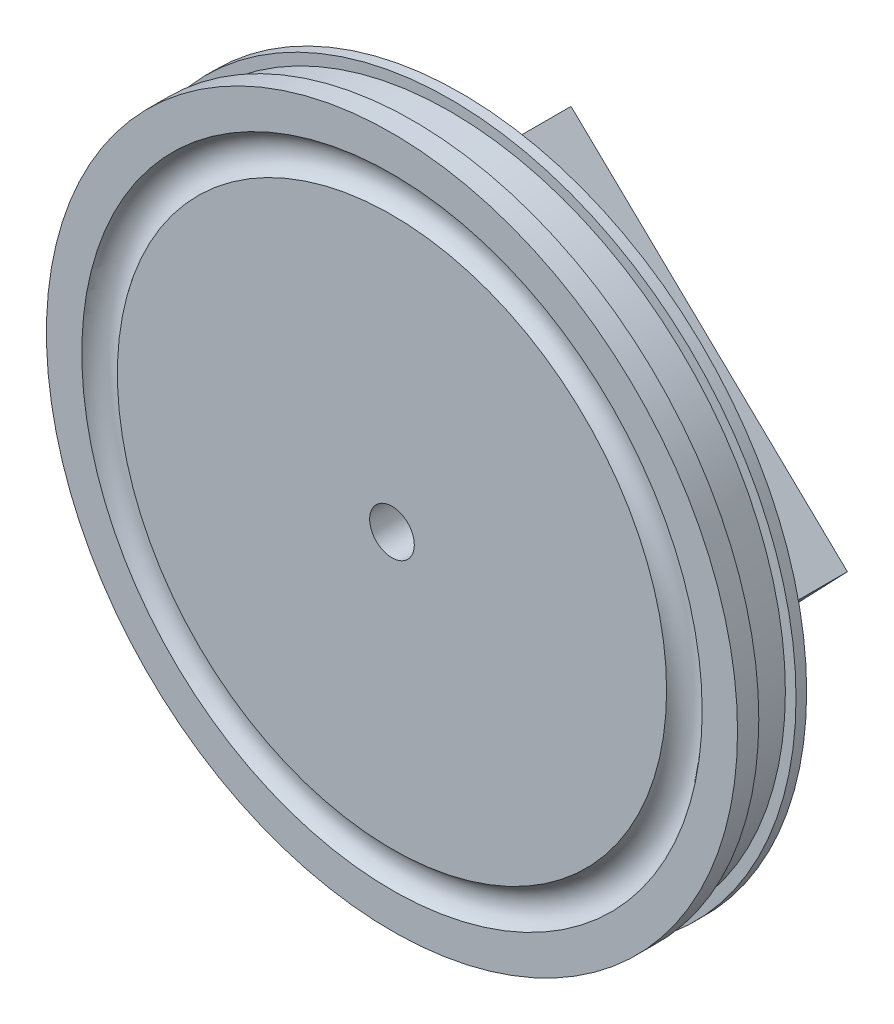
ISO-10303-21;
HEADER;
FILE_DESCRIPTION(('STEP AP214'),'2;1');
FILE_NAME('part.step','',(''),(''),'','','');
FILE_SCHEMA(('AUTOMOTIVE_DESIGN { 1 0 10303 214 1 1 1 1 }'));
ENDSEC;
DATA;
#1=APPLICATION_CONTEXT('core data for automotive mechanical design processes');
#2=APPLICATION_PROTOCOL_DEFINITION('international standard','automotive_design',2000,#1);
#3=PRODUCT_CONTEXT('',#1,'mechanical');
#4=PRODUCT('Part','Part','',(#3));
#5=PRODUCT_RELATED_PRODUCT_CATEGORY('part','',(#4));
#6=PRODUCT_DEFINITION_FORMATION('','',#4);
#7=PRODUCT_DEFINITION_CONTEXT('part definition',#1,'design');
#8=PRODUCT_DEFINITION('design','',#6,#7);
#9=PRODUCT_DEFINITION_SHAPE('','',#8);
#10=(LENGTH_UNIT() NAMED_UNIT(*) SI_UNIT(.MILLI.,.METRE.));
#11=(NAMED_UNIT(*) PLANE_ANGLE_UNIT() SI_UNIT($,.RADIAN.));
#12=(NAMED_UNIT(*) SI_UNIT($,.STERADIAN.) SOLID_ANGLE_UNIT());
#13=UNCERTAINTY_MEASURE_WITH_UNIT(LENGTH_MEASURE(1.E-05),#10,'distance_accuracy_value','');
#14=(GEOMETRIC_REPRESENTATION_CONTEXT(3) GLOBAL_UNCERTAINTY_ASSIGNED_CONTEXT((#13)) GLOBAL_UNIT_ASSIGNED_CONTEXT((#10,
#11,#12)) REPRESENTATION_CONTEXT('',''));
#15=CARTESIAN_POINT('',(0.,0.,0.));
#16=DIRECTION('',(0.,0.,1.));
#17=DIRECTION('',(1.,0.,0.));
#18=AXIS2_PLACEMENT_3D('',#15,#16,#17);
#19=CARTESIAN_POINT('',(22.5865973500949,41.8651611074524,139.421413437516));
#20=DIRECTION('',(0.,0.,1.));
#21=DIRECTION('',(1.,0.,0.));
#22=AXIS2_PLACEMENT_3D('',#19,#20,#21);
#23=TOROIDAL_SURFACE('',#22,55.,3.8);
#24=CARTESIAN_POINT('',(22.5865973500949,41.8651611074524,137.621413437516));
#25=DIRECTION('',(0.,0.,1.));
#26=DIRECTION('',(1.,0.,0.));
#27=AXIS2_PLACEMENT_3D('',#24,#25,#26);
#28=CIRCLE('',#27,51.6533598938637);
#29=CARTESIAN_POINT('',(74.2399572439586,41.8651611074524,137.621413437516));
#30=VERTEX_POINT('',#29);
#31=EDGE_CURVE('E139',#30,#30,#28,.T.);
#32=ORIENTED_EDGE('',*,*,#31,.F.);
#33=EDGE_LOOP('',(#32));
#34=FACE_BOUND('',#33,.T.);
#35=CARTESIAN_POINT('',(22.5865973500949,41.8651611074524,137.621413437516));
#36=DIRECTION('',(0.,0.,1.));
#37=DIRECTION('',(1.,0.,0.));
#38=AXIS2_PLACEMENT_3D('',#35,#36,#37);
#39=CIRCLE('',#38,58.3466401061363);
#40=CARTESIAN_POINT('',(80.9332374562313,41.8651611074524,137.621413437516));
#41=VERTEX_POINT('',#40);
#42=EDGE_CURVE('E170',#41,#41,#39,.T.);
#43=ORIENTED_EDGE('',*,*,#42,.T.);
#44=EDGE_LOOP('',(#43));
#45=FACE_BOUND('',#44,.T.);
#46=ADVANCED_FACE('F46',(#34,#45),#23,.F.);
#47=CARTESIAN_POINT('',(22.5865973500949,41.8651611074524,137.621413437516));
#48=DIRECTION('',(0.,0.,-1.));
#49=DIRECTION('',(-1.,0.,0.));
#50=AXIS2_PLACEMENT_3D('',#47,#48,#49);
#51=PLANE('',#50);
#52=ORIENTED_EDGE('',*,*,#42,.F.);
#53=EDGE_LOOP('',(#52));
#54=FACE_BOUND('',#53,.T.);
#55=CARTESIAN_POINT('',(22.5865973500949,41.8651611074524,137.621413437516));
#56=DIRECTION('',(0.,0.,1.));
#57=DIRECTION('',(1.,0.,0.));
#58=AXIS2_PLACEMENT_3D('',#55,#56,#57);
#59=CIRCLE('',#58,65.);
#60=CARTESIAN_POINT('',(87.5865973500949,41.8651611074524,137.621413437516));
#61=VERTEX_POINT('',#60);
#62=EDGE_CURVE('E175',#61,#61,#59,.T.);
#63=ORIENTED_EDGE('',*,*,#62,.T.);
#64=EDGE_LOOP('',(#63));
#65=FACE_BOUND('',#64,.T.);
#66=ADVANCED_FACE('F215',(#54,#65),#51,.F.);
#67=CARTESIAN_POINT('',(22.5865973500949,41.8651611074524,137.621413437516));
#68=DIRECTION('',(0.,0.,1.));
#69=DIRECTION('',(1.,0.,0.));
#70=AXIS2_PLACEMENT_3D('',#67,#68,#69);
#71=CYLINDRICAL_SURFACE('',#70,65.);
#72=ORIENTED_EDGE('',*,*,#62,.F.);
#73=EDGE_LOOP('',(#72));
#74=FACE_BOUND('',#73,.T.);
#75=CARTESIAN_POINT('',(22.5865973500949,41.8651611074524,133.621413437516));
#76=DIRECTION('',(0.,0.,1.));
#77=DIRECTION('',(1.,0.,0.));
#78=AXIS2_PLACEMENT_3D('',#75,#76,#77);
#79=CIRCLE('',#78,65.);
#80=CARTESIAN_POINT('',(87.5865973500949,41.8651611074524,133.621413437516));
#81=VERTEX_POINT('',#80);
#82=EDGE_CURVE('E162',#81,#81,#79,.T.);
#83=ORIENTED_EDGE('',*,*,#82,.T.);
#84=EDGE_LOOP('',(#83));
#85=FACE_BOUND('',#84,.T.);
#86=ADVANCED_FACE('F222',(#74,#85),#71,.T.);
#87=CARTESIAN_POINT('',(22.5865973500949,41.8651611074524,133.621413437516));
#88=DIRECTION('',(0.,0.,1.));
#89=DIRECTION('',(1.,0.,0.));
#90=AXIS2_PLACEMENT_3D('',#87,#88,#89);
#91=PLANE('',#90);
#92=ORIENTED_EDGE('',*,*,#82,.F.);
#93=EDGE_LOOP('',(#92));
#94=FACE_BOUND('',#93,.T.);
#95=CARTESIAN_POINT('',(22.5865973500949,41.8651611074524,133.621413437516));
#96=DIRECTION('',(0.,0.,1.));
#97=DIRECTION('',(1.,0.,0.));
#98=AXIS2_PLACEMENT_3D('',#95,#96,#97);
#99=CIRCLE('',#98,63.);
#100=CARTESIAN_POINT('',(85.5865973500949,41.8651611074524,133.621413437516));
#101=VERTEX_POINT('',#100);
#102=EDGE_CURVE('E156',#101,#101,#99,.T.);
#103=ORIENTED_EDGE('',*,*,#102,.T.);
#104=EDGE_LOOP('',(#103));
#105=FACE_BOUND('',#104,.T.);
#106=ADVANCED_FACE('F235',(#94,#105),#91,.F.);
#107=CARTESIAN_POINT('',(22.5865973500949,41.8651611074524,137.621413437516));
#108=DIRECTION('',(0.,0.,1.));
#109=DIRECTION('',(1.,0.,0.));
#110=AXIS2_PLACEMENT_3D('',#107,#108,#109);
#111=CYLINDRICAL_SURFACE('',#110,63.);
#112=ORIENTED_EDGE('',*,*,#102,.F.);
#113=EDGE_LOOP('',(#112));
#114=FACE_BOUND('',#113,.T.);
#115=CARTESIAN_POINT('',(22.5865973500949,41.8651611074524,126.621413437516));
#116=DIRECTION('',(0.,0.,1.));
#117=DIRECTION('',(1.,0.,0.));
#118=AXIS2_PLACEMENT_3D('',#115,#116,#117);
#119=CIRCLE('',#118,63.);
#120=CARTESIAN_POINT('',(85.5865973500949,41.8651611074524,126.621413437516));
#121=VERTEX_POINT('',#120);
#122=EDGE_CURVE('E152',#121,#121,#119,.T.);
#123=ORIENTED_EDGE('',*,*,#122,.T.);
#124=EDGE_LOOP('',(#123));
#125=FACE_BOUND('',#124,.T.);
#126=ADVANCED_FACE('F238',(#114,#125),#111,.T.);
#127=CARTESIAN_POINT('',(22.5865973500949,41.8651611074524,126.621413437516));
#128=DIRECTION('',(0.,0.,-1.));
#129=DIRECTION('',(-1.,0.,0.));
#130=AXIS2_PLACEMENT_3D('',#127,#128,#129);
#131=PLANE('',#130);
#132=ORIENTED_EDGE('',*,*,#122,.F.);
#133=EDGE_LOOP('',(#132));
#134=FACE_BOUND('',#133,.T.);
#135=CARTESIAN_POINT('',(22.5865973500949,41.8651611074524,126.621413437516));
#136=DIRECTION('',(0.,0.,1.));
#137=DIRECTION('',(1.,0.,0.));
#138=AXIS2_PLACEMENT_3D('',#135,#136,#137);
#139=CIRCLE('',#138,65.);
#140=CARTESIAN_POINT('',(87.5865973500949,41.8651611074524,126.621413437516));
#141=VERTEX_POINT('',#140);
#142=EDGE_CURVE('E157',#141,#141,#139,.T.);
#143=ORIENTED_EDGE('',*,*,#142,.T.);
#144=EDGE_LOOP('',(#143));
#145=FACE_BOUND('',#144,.T.);
#146=ADVANCED_FACE('F244',(#134,#145),#131,.F.);
#147=CARTESIAN_POINT('',(22.5865973500949,41.8651611074524,137.621413437516));
#148=DIRECTION('',(0.,0.,1.));
#149=DIRECTION('',(1.,0.,0.));
#150=AXIS2_PLACEMENT_3D('',#147,#148,#149);
#151=CYLINDRICAL_SURFACE('',#150,65.);
#152=ORIENTED_EDGE('',*,*,#142,.F.);
#153=EDGE_LOOP('',(#152));
#154=FACE_BOUND('',#153,.T.);
#155=CARTESIAN_POINT('',(22.5865973500949,41.8651611074524,124.621413437516));
#156=DIRECTION('',(0.,0.,1.));
#157=DIRECTION('',(1.,0.,0.));
#158=AXIS2_PLACEMENT_3D('',#155,#156,#157);
#159=CIRCLE('',#158,65.);
#160=CARTESIAN_POINT('',(87.5865973500949,41.8651611074524,124.621413437516));
#161=VERTEX_POINT('',#160);
#162=EDGE_CURVE('E143',#161,#161,#159,.T.);
#163=ORIENTED_EDGE('',*,*,#162,.T.);
#164=EDGE_LOOP('',(#163));
#165=FACE_BOUND('',#164,.T.);
#166=ADVANCED_FACE('F250',(#154,#165),#151,.T.);
#167=CARTESIAN_POINT('',(22.5865973500949,41.8651611074524,124.621413437516));
#168=DIRECTION('',(0.,0.,1.));
#169=DIRECTION('',(1.,0.,0.));
#170=AXIS2_PLACEMENT_3D('',#167,#168,#169);
#171=PLANE('',#170);
#172=DIRECTION('',(0.971238037767916,-0.238110633934583,0.));
#173=VECTOR('',#172,1.);
#174=CARTESIAN_POINT('',(20.8722007857659,34.8722472355232,124.621413437516));
#175=LINE('',#174,#173);
#176=CARTESIAN_POINT('',(16.8348400793879,35.8620545534363,124.621413437516));
#177=VERTEX_POINT('',#176);
#178=CARTESIAN_POINT('',(24.9095614921444,33.88243991761,124.621413437516));
#179=VERTEX_POINT('',#178);
#180=EDGE_CURVE('E174',#177,#179,#175,.T.);
#181=ORIENTED_EDGE('',*,*,#180,.T.);
#182=DIRECTION('',(0.691828876782493,0.722061496861503,0.));
#183=VECTOR('',#182,1.);
#184=CARTESIAN_POINT('',(27.785440127498,36.8839931946182,124.621413437516));
#185=LINE('',#184,#183);
#186=CARTESIAN_POINT('',(30.6613187628514,39.8855464716263,124.621413437516));
#187=VERTEX_POINT('',#186);
#188=EDGE_CURVE('E13',#179,#187,#185,.T.);
#189=ORIENTED_EDGE('',*,*,#188,.T.);
#190=DIRECTION('',(-0.279409160985423,0.960172130796047,0.));
#191=VECTOR('',#190,1.);
#192=CARTESIAN_POINT('',(29.4998366918267,43.8769070665475,124.621413437516));
#193=LINE('',#192,#191);
#194=CARTESIAN_POINT('',(28.3383546208021,47.8682676614685,124.621413437516));
#195=VERTEX_POINT('',#194);
#196=EDGE_CURVE('E53',#187,#195,#193,.T.);
#197=ORIENTED_EDGE('',*,*,#196,.T.);
#198=DIRECTION('',(-0.971238037767922,0.238110633934557,0.));
#199=VECTOR('',#198,1.);
#200=CARTESIAN_POINT('',(24.3009939144238,48.8580749793815,124.621413437516));
#201=LINE('',#200,#199);
#202=CARTESIAN_POINT('',(20.2636332080457,49.8478822972945,124.621413437516));
#203=VERTEX_POINT('',#202);
#204=EDGE_CURVE('E190',#195,#203,#201,.T.);
#205=ORIENTED_EDGE('',*,*,#204,.T.);
#206=DIRECTION('',(-0.691828876782508,-0.722061496861489,0.));
#207=VECTOR('',#206,1.);
#208=CARTESIAN_POINT('',(17.3877545726922,46.8463290202865,124.621413437516));
#209=LINE('',#208,#207);
#210=CARTESIAN_POINT('',(14.5118759373386,43.8447757432784,124.621413437516));
#211=VERTEX_POINT('',#210);
#212=EDGE_CURVE('E187',#203,#211,#209,.T.);
#213=ORIENTED_EDGE('',*,*,#212,.T.);
#214=DIRECTION('',(0.279409160985413,-0.96017213079605,0.));
#215=VECTOR('',#214,1.);
#216=CARTESIAN_POINT('',(15.6733580083633,39.8534151483574,124.621413437516));
#217=LINE('',#216,#215);
#218=EDGE_CURVE('E184',#211,#177,#217,.T.);
#219=ORIENTED_EDGE('',*,*,#218,.T.);
#220=EDGE_LOOP('',(#181,#189,#197,#205,#213,#219));
#221=FACE_BOUND('',#220,.T.);
#222=ORIENTED_EDGE('',*,*,#162,.F.);
#223=EDGE_LOOP('',(#222));
#224=FACE_BOUND('',#223,.T.);
#225=ADVANCED_FACE('F193',(#221,#224),#171,.F.);
#226=CARTESIAN_POINT('',(22.5865973500949,41.8651611074524,137.621413437516));
#227=DIRECTION('',(0.,0.,1.));
#228=DIRECTION('',(1.,0.,0.));
#229=AXIS2_PLACEMENT_3D('',#226,#227,#228);
#230=PLANE('',#229);
#231=CARTESIAN_POINT('',(22.5865973500949,41.8651611074524,137.621413437516));
#232=DIRECTION('',(0.,0.,1.));
#233=DIRECTION('',(1.,0.,0.));
#234=AXIS2_PLACEMENT_3D('',#231,#232,#233);
#235=CIRCLE('',#234,4.2);
#236=CARTESIAN_POINT('',(26.7865973500949,41.8651611074524,137.621413437516));
#237=VERTEX_POINT('',#236);
#238=EDGE_CURVE('E144',#237,#237,#235,.T.);
#239=ORIENTED_EDGE('',*,*,#238,.F.);
#240=EDGE_LOOP('',(#239));
#241=FACE_BOUND('',#240,.T.);
#242=ORIENTED_EDGE('',*,*,#31,.T.);
#243=EDGE_LOOP('',(#242));
#244=FACE_BOUND('',#243,.T.);
#245=ADVANCED_FACE('F259',(#241,#244),#230,.T.);
#246=CARTESIAN_POINT('',(22.5865973500949,41.8651611074524,162.621413437516));
#247=DIRECTION('',(0.,0.,-1.));
#248=DIRECTION('',(-1.,0.,0.));
#249=AXIS2_PLACEMENT_3D('',#246,#247,#248);
#250=CYLINDRICAL_SURFACE('',#249,4.2);
#251=CARTESIAN_POINT('',(22.5865973500949,41.8651611074524,126.621413437516));
#252=DIRECTION('',(0.,0.,1.));
#253=DIRECTION('',(1.,0.,0.));
#254=AXIS2_PLACEMENT_3D('',#251,#252,#253);
#255=CIRCLE('',#254,4.2);
#256=CARTESIAN_POINT('',(26.7865973500949,41.8651611074524,126.621413437516));
#257=VERTEX_POINT('',#256);
#258=EDGE_CURVE('E129',#257,#257,#255,.F.);
#259=ORIENTED_EDGE('',*,*,#258,.T.);
#260=EDGE_LOOP('',(#259));
#261=FACE_BOUND('',#260,.T.);
#262=ORIENTED_EDGE('',*,*,#238,.T.);
#263=EDGE_LOOP('',(#262));
#264=FACE_BOUND('',#263,.T.);
#265=ADVANCED_FACE('F211',(#261,#264),#250,.F.);
#266=CARTESIAN_POINT('',(24.9095614921444,33.88243991761,126.621413437516));
#267=DIRECTION('',(0.722061496861503,-0.691828876782493,0.));
#268=DIRECTION('',(0.691828876782493,0.722061496861503,0.));
#269=AXIS2_PLACEMENT_3D('',#266,#267,#268);
#270=PLANE('',#269);
#271=DIRECTION('',(0.,0.,-1.));
#272=VECTOR('',#271,1.);
#273=CARTESIAN_POINT('',(24.9095614921444,33.88243991761,126.621413437516));
#274=LINE('',#273,#272);
#275=CARTESIAN_POINT('',(24.9095614921444,33.88243991761,126.621413437516));
#276=VERTEX_POINT('',#275);
#277=EDGE_CURVE('E60',#276,#179,#274,.T.);
#278=ORIENTED_EDGE('',*,*,#277,.F.);
#279=DIRECTION('',(-0.691828876782493,-0.722061496861503,0.));
#280=VECTOR('',#279,1.);
#281=CARTESIAN_POINT('',(24.9095614921444,33.88243991761,126.621413437516));
#282=LINE('',#281,#280);
#283=CARTESIAN_POINT('',(30.6613187628514,39.8855464716263,126.621413437516));
#284=VERTEX_POINT('',#283);
#285=EDGE_CURVE('E99',#284,#276,#282,.T.);
#286=ORIENTED_EDGE('',*,*,#285,.F.);
#287=DIRECTION('',(0.,0.,-1.));
#288=VECTOR('',#287,1.);
#289=CARTESIAN_POINT('',(30.6613187628514,39.8855464716263,126.621413437516));
#290=LINE('',#289,#288);
#291=EDGE_CURVE('E127',#284,#187,#290,.T.);
#292=ORIENTED_EDGE('',*,*,#291,.T.);
#293=ORIENTED_EDGE('',*,*,#188,.F.);
#294=EDGE_LOOP('',(#278,#286,#292,#293));
#295=FACE_BOUND('',#294,.T.);
#296=ADVANCED_FACE('F97',(#295),#270,.F.);
#297=CARTESIAN_POINT('',(30.6613187628514,39.8855464716263,126.621413437516));
#298=DIRECTION('',(0.960172130796047,0.279409160985423,0.));
#299=DIRECTION('',(-0.279409160985423,0.960172130796047,0.));
#300=AXIS2_PLACEMENT_3D('',#297,#298,#299);
#301=PLANE('',#300);
#302=ORIENTED_EDGE('',*,*,#291,.F.);
#303=DIRECTION('',(0.279409160985423,-0.960172130796047,0.));
#304=VECTOR('',#303,1.);
#305=CARTESIAN_POINT('',(30.6613187628514,39.8855464716263,126.621413437516));
#306=LINE('',#305,#304);
#307=CARTESIAN_POINT('',(28.3383546208021,47.8682676614685,126.621413437516));
#308=VERTEX_POINT('',#307);
#309=EDGE_CURVE('E103',#308,#284,#306,.T.);
#310=ORIENTED_EDGE('',*,*,#309,.F.);
#311=DIRECTION('',(0.,0.,-1.));
#312=VECTOR('',#311,1.);
#313=CARTESIAN_POINT('',(28.3383546208021,47.8682676614685,126.621413437516));
#314=LINE('',#313,#312);
#315=EDGE_CURVE('E130',#308,#195,#314,.T.);
#316=ORIENTED_EDGE('',*,*,#315,.T.);
#317=ORIENTED_EDGE('',*,*,#196,.F.);
#318=EDGE_LOOP('',(#302,#310,#316,#317));
#319=FACE_BOUND('',#318,.T.);
#320=ADVANCED_FACE('F203',(#319),#301,.F.);
#321=CARTESIAN_POINT('',(28.3383546208021,47.8682676614685,126.621413437516));
#322=DIRECTION('',(0.238110633934557,0.971238037767922,0.));
#323=DIRECTION('',(-0.971238037767922,0.238110633934557,0.));
#324=AXIS2_PLACEMENT_3D('',#321,#322,#323);
#325=PLANE('',#324);
#326=ORIENTED_EDGE('',*,*,#315,.F.);
#327=DIRECTION('',(0.971238037767922,-0.238110633934557,0.));
#328=VECTOR('',#327,1.);
#329=CARTESIAN_POINT('',(28.3383546208021,47.8682676614685,126.621413437516));
#330=LINE('',#329,#328);
#331=CARTESIAN_POINT('',(20.2636332080457,49.8478822972945,126.621413437516));
#332=VERTEX_POINT('',#331);
#333=EDGE_CURVE('E124',#332,#308,#330,.T.);
#334=ORIENTED_EDGE('',*,*,#333,.F.);
#335=DIRECTION('',(0.,0.,-1.));
#336=VECTOR('',#335,1.);
#337=CARTESIAN_POINT('',(20.2636332080457,49.8478822972945,126.621413437516));
#338=LINE('',#337,#336);
#339=EDGE_CURVE('E132',#332,#203,#338,.T.);
#340=ORIENTED_EDGE('',*,*,#339,.T.);
#341=ORIENTED_EDGE('',*,*,#204,.F.);
#342=EDGE_LOOP('',(#326,#334,#340,#341));
#343=FACE_BOUND('',#342,.T.);
#344=ADVANCED_FACE('F202',(#343),#325,.F.);
#345=CARTESIAN_POINT('',(20.2636332080457,49.8478822972945,126.621413437516));
#346=DIRECTION('',(-0.722061496861489,0.691828876782508,0.));
#347=DIRECTION('',(-0.691828876782508,-0.722061496861489,0.));
#348=AXIS2_PLACEMENT_3D('',#345,#346,#347);
#349=PLANE('',#348);
#350=ORIENTED_EDGE('',*,*,#339,.F.);
#351=DIRECTION('',(0.691828876782508,0.722061496861489,0.));
#352=VECTOR('',#351,1.);
#353=CARTESIAN_POINT('',(20.2636332080457,49.8478822972945,126.621413437516));
#354=LINE('',#353,#352);
#355=CARTESIAN_POINT('',(14.5118759373386,43.8447757432784,126.621413437516));
#356=VERTEX_POINT('',#355);
#357=EDGE_CURVE('E121',#356,#332,#354,.T.);
#358=ORIENTED_EDGE('',*,*,#357,.F.);
#359=DIRECTION('',(0.,0.,-1.));
#360=VECTOR('',#359,1.);
#361=CARTESIAN_POINT('',(14.5118759373386,43.8447757432784,126.621413437516));
#362=LINE('',#361,#360);
#363=EDGE_CURVE('E135',#356,#211,#362,.T.);
#364=ORIENTED_EDGE('',*,*,#363,.T.);
#365=ORIENTED_EDGE('',*,*,#212,.F.);
#366=EDGE_LOOP('',(#350,#358,#364,#365));
#367=FACE_BOUND('',#366,.T.);
#368=ADVANCED_FACE('F200',(#367),#349,.F.);
#369=CARTESIAN_POINT('',(14.5118759373386,43.8447757432784,126.621413437516));
#370=DIRECTION('',(-0.96017213079605,-0.279409160985413,0.));
#371=DIRECTION('',(0.279409160985413,-0.96017213079605,0.));
#372=AXIS2_PLACEMENT_3D('',#369,#370,#371);
#373=PLANE('',#372);
#374=ORIENTED_EDGE('',*,*,#363,.F.);
#375=DIRECTION('',(-0.279409160985413,0.96017213079605,0.));
#376=VECTOR('',#375,1.);
#377=CARTESIAN_POINT('',(14.5118759373386,43.8447757432784,126.621413437516));
#378=LINE('',#377,#376);
#379=CARTESIAN_POINT('',(16.8348400793879,35.8620545534363,126.621413437516));
#380=VERTEX_POINT('',#379);
#381=EDGE_CURVE('E112',#380,#356,#378,.T.);
#382=ORIENTED_EDGE('',*,*,#381,.F.);
#383=DIRECTION('',(0.,0.,-1.));
#384=VECTOR('',#383,1.);
#385=CARTESIAN_POINT('',(16.8348400793879,35.8620545534363,126.621413437516));
#386=LINE('',#385,#384);
#387=EDGE_CURVE('E102',#380,#177,#386,.T.);
#388=ORIENTED_EDGE('',*,*,#387,.T.);
#389=ORIENTED_EDGE('',*,*,#218,.F.);
#390=EDGE_LOOP('',(#374,#382,#388,#389));
#391=FACE_BOUND('',#390,.T.);
#392=ADVANCED_FACE('F196',(#391),#373,.F.);
#393=CARTESIAN_POINT('',(16.8348400793879,35.8620545534363,126.621413437516));
#394=DIRECTION('',(-0.238110633934583,-0.971238037767916,0.));
#395=DIRECTION('',(0.971238037767916,-0.238110633934583,0.));
#396=AXIS2_PLACEMENT_3D('',#393,#394,#395);
#397=PLANE('',#396);
#398=ORIENTED_EDGE('',*,*,#387,.F.);
#399=DIRECTION('',(-0.971238037767916,0.238110633934583,0.));
#400=VECTOR('',#399,1.);
#401=CARTESIAN_POINT('',(16.8348400793879,35.8620545534363,126.621413437516));
#402=LINE('',#401,#400);
#403=EDGE_CURVE('E106',#276,#380,#402,.T.);
#404=ORIENTED_EDGE('',*,*,#403,.F.);
#405=ORIENTED_EDGE('',*,*,#277,.T.);
#406=ORIENTED_EDGE('',*,*,#180,.F.);
#407=EDGE_LOOP('',(#398,#404,#405,#406));
#408=FACE_BOUND('',#407,.T.);
#409=ADVANCED_FACE('F107',(#408),#397,.F.);
#410=CARTESIAN_POINT('',(0.,0.,126.621413437516));
#411=DIRECTION('',(0.,0.,1.));
#412=DIRECTION('',(1.,0.,0.));
#413=AXIS2_PLACEMENT_3D('',#410,#411,#412);
#414=PLANE('',#413);
#415=ORIENTED_EDGE('',*,*,#285,.T.);
#416=ORIENTED_EDGE('',*,*,#403,.T.);
#417=ORIENTED_EDGE('',*,*,#381,.T.);
#418=ORIENTED_EDGE('',*,*,#357,.T.);
#419=ORIENTED_EDGE('',*,*,#333,.T.);
#420=ORIENTED_EDGE('',*,*,#309,.T.);
#421=EDGE_LOOP('',(#415,#416,#417,#418,#419,#420));
#422=FACE_BOUND('',#421,.T.);
#423=ORIENTED_EDGE('',*,*,#258,.F.);
#424=EDGE_LOOP('',(#423));
#425=FACE_BOUND('',#424,.T.);
#426=ADVANCED_FACE('F114',(#422,#425),#414,.F.);
#427=CLOSED_SHELL('',(#46,#66,#86,#106,#126,#146,#166,#225,#245,#265,#296,#320,#344,#368,#392,
#409,#426));
#428=MANIFOLD_SOLID_BREP('B2',#427);
#429=CARTESIAN_POINT('',(-44.4883245814592,141.208387733411,124.621413437516));
#430=DIRECTION('',(0.,0.,-1.));
#431=DIRECTION('',(0.691828876782508,0.722061496861488,0.));
#432=AXIS2_PLACEMENT_3D('',#429,#430,#431);
#433=PLANE('',#432);
#434=DIRECTION('',(0.279409160985423,-0.960172130796047,0.));
#435=VECTOR('',#434,1.);
#436=CARTESIAN_POINT('',(-2.38855673537105,153.459379440288,124.621413437516));
#437=LINE('',#436,#435);
#438=CARTESIAN_POINT('',(28.3383546208021,47.8682676614685,124.621413437516));
#439=VERTEX_POINT('',#438);
#440=CARTESIAN_POINT('',(30.6613187628514,39.8855464716263,124.621413437516));
#441=VERTEX_POINT('',#440);
#442=EDGE_CURVE('E529',#439,#441,#437,.T.);
#443=ORIENTED_EDGE('',*,*,#442,.T.);
#444=DIRECTION('',(-0.691828876782493,-0.722061496861503,0.));
#445=VECTOR('',#444,1.);
#446=CARTESIAN_POINT('',(45.3077713016001,55.1720425962521,124.621413437516));
#447=LINE('',#446,#445);
#448=CARTESIAN_POINT('',(24.9095614921444,33.88243991761,124.621413437516));
#449=VERTEX_POINT('',#448);
#450=EDGE_CURVE('E520',#441,#449,#447,.T.);
#451=ORIENTED_EDGE('',*,*,#450,.T.);
#452=DIRECTION('',(-0.971238037767916,0.238110633934583,0.));
#453=VECTOR('',#452,1.);
#454=CARTESIAN_POINT('',(-65.3741198584709,56.0165653990914,124.621413437516));
#455=LINE('',#454,#453);
#456=CARTESIAN_POINT('',(16.8348400793879,35.8620545534363,124.621413437516));
#457=VERTEX_POINT('',#456);
#458=EDGE_CURVE('E526',#449,#457,#455,.T.);
#459=ORIENTED_EDGE('',*,*,#458,.T.);
#460=DIRECTION('',(-0.279409160985413,0.96017213079605,0.));
#461=VECTOR('',#460,1.);
#462=CARTESIAN_POINT('',(-16.2150354188332,149.435887522098,124.621413437516));
#463=LINE('',#462,#461);
#464=CARTESIAN_POINT('',(14.5118759373386,43.8447757432784,124.621413437516));
#465=VERTEX_POINT('',#464);
#466=EDGE_CURVE('E503',#457,#465,#463,.T.);
#467=ORIENTED_EDGE('',*,*,#466,.T.);
#468=DIRECTION('',(0.691828876782508,0.722061496861489,0.));
#469=VECTOR('',#468,1.);
#470=CARTESIAN_POINT('',(34.910085746793,65.1343784219183,124.621413437516));
#471=LINE('',#470,#469);
#472=CARTESIAN_POINT('',(20.2636332080457,49.8478822972945,124.621413437516));
#473=VERTEX_POINT('',#472);
#474=EDGE_CURVE('E514',#465,#473,#471,.T.);
#475=ORIENTED_EDGE('',*,*,#474,.T.);
#476=DIRECTION('',(0.971238037767922,-0.238110633934557,0.));
#477=VECTOR('',#476,1.);
#478=CARTESIAN_POINT('',(-61.9453267298115,70.002393142947,124.621413437516));
#479=LINE('',#478,#477);
#480=EDGE_CURVE('E527',#473,#439,#479,.T.);
#481=ORIENTED_EDGE('',*,*,#480,.T.);
#482=EDGE_LOOP('',(#443,#451,#459,#467,#475,#481));
#483=FACE_BOUND('',#482,.T.);
#484=DIRECTION('',(0.722061496861488,-0.691828876782508,0.));
#485=VECTOR('',#484,1.);
#486=CARTESIAN_POINT('',(19.5239984122433,-13.3672613249003,124.621413437516));
#487=LINE('',#486,#485);
#488=CARTESIAN_POINT('',(-28.8541218774764,32.9852734195278,124.621413437516));
#489=VERTEX_POINT('',#488);
#490=CARTESIAN_POINT('',(15.9136909279358,-9.90811694098775,124.621413437516));
#491=VERTEX_POINT('',#490);
#492=EDGE_CURVE('E634',#489,#491,#487,.T.);
#493=ORIENTED_EDGE('',*,*,#492,.T.);
#494=CARTESIAN_POINT('',(19.3728353118484,-6.2978094566803,124.621413437516));
#495=DIRECTION('',(0.,0.,-1.));
#496=DIRECTION('',(0.,1.,0.));
#497=AXIS2_PLACEMENT_3D('',#494,#495,#496);
#498=CIRCLE('',#497,5.);
#499=CARTESIAN_POINT('',(22.9831427961559,-9.75695384059284,124.621413437516));
#500=VERTEX_POINT('',#499);
#501=EDGE_CURVE('E391',#491,#500,#498,.F.);
#502=ORIENTED_EDGE('',*,*,#501,.T.);
#503=DIRECTION('',(0.691828876782508,0.722061496861488,0.));
#504=VECTOR('',#503,1.);
#505=CARTESIAN_POINT('',(85.2477417065816,55.2285808769411,124.621413437516));
#506=LINE('',#505,#504);
#507=CARTESIAN_POINT('',(85.2477417065816,55.2285808769411,124.621413437516));
#508=VERTEX_POINT('',#507);
#509=EDGE_CURVE('E632',#500,#508,#506,.T.);
#510=ORIENTED_EDGE('',*,*,#509,.T.);
#511=DIRECTION('',(-0.722061496861488,0.691828876782508,0.));
#512=VECTOR('',#511,1.);
#513=CARTESIAN_POINT('',(85.2477417065816,55.2285808769411,124.621413437516));
#514=LINE('',#513,#512);
#515=CARTESIAN_POINT('',(33.2593139325544,105.040260005282,124.621413437516));
#516=VERTEX_POINT('',#515);
#517=EDGE_CURVE('E641',#508,#516,#514,.T.);
#518=ORIENTED_EDGE('',*,*,#517,.T.);
#519=DIRECTION('',(-0.691828876782508,-0.722061496861488,0.));
#520=VECTOR('',#519,1.);
#521=CARTESIAN_POINT('',(33.2593139325544,105.040260005282,124.621413437516));
#522=LINE('',#521,#520);
#523=CARTESIAN_POINT('',(-29.0052849778713,40.0547252877477,124.621413437516));
#524=VERTEX_POINT('',#523);
#525=EDGE_CURVE('E782',#516,#524,#522,.T.);
#526=ORIENTED_EDGE('',*,*,#525,.T.);
#527=CARTESIAN_POINT('',(-25.3949774935639,36.5955809038352,124.621413437516));
#528=DIRECTION('',(0.,0.,-1.));
#529=DIRECTION('',(0.,1.,0.));
#530=AXIS2_PLACEMENT_3D('',#527,#528,#529);
#531=CIRCLE('',#530,5.);
#532=EDGE_CURVE('E628',#524,#489,#531,.F.);
#533=ORIENTED_EDGE('',*,*,#532,.T.);
#534=EDGE_LOOP('',(#493,#502,#510,#518,#526,#533));
#535=FACE_BOUND('',#534,.T.);
#536=CARTESIAN_POINT('',(53.2689288891572,62.324743980206,124.621413437516));
#537=DIRECTION('',(0.,0.,1.));
#538=DIRECTION('',(-0.691828876782508,-0.722061496861488,0.));
#539=AXIS2_PLACEMENT_3D('',#536,#537,#538);
#540=CIRCLE('',#539,2.20000000000001);
#541=CARTESIAN_POINT('',(51.7469053602357,60.7362086871107,124.621413437516));
#542=VERTEX_POINT('',#541);
#543=EDGE_CURVE('E789',#542,#542,#540,.T.);
#544=ORIENTED_EDGE('',*,*,#543,.F.);
#545=EDGE_LOOP('',(#544));
#546=FACE_BOUND('',#545,.T.);
#547=CARTESIAN_POINT('',(41.7159449393734,73.3940060087261,124.621413437516));
#548=DIRECTION('',(0.,0.,1.));
#549=DIRECTION('',(-0.691828876782508,-0.722061496861488,0.));
#550=AXIS2_PLACEMENT_3D('',#547,#548,#549);
#551=CIRCLE('',#550,2.2);
#552=CARTESIAN_POINT('',(40.1939214104519,71.8054707156309,124.621413437516));
#553=VERTEX_POINT('',#552);
#554=EDGE_CURVE('E578',#553,#553,#551,.T.);
#555=ORIENTED_EDGE('',*,*,#554,.F.);
#556=EDGE_LOOP('',(#555));
#557=FACE_BOUND('',#556,.T.);
#558=CARTESIAN_POINT('',(17.9856561732493,25.4996076402701,124.621413437516));
#559=DIRECTION('',(0.,0.,1.));
#560=DIRECTION('',(-0.691828876782508,-0.722061496861488,0.));
#561=AXIS2_PLACEMENT_3D('',#558,#559,#560);
#562=CIRCLE('',#561,2.1942799116235);
#563=CARTESIAN_POINT('',(16.4675899666444,23.9152026027501,124.621413437516));
#564=VERTEX_POINT('',#563);
#565=EDGE_CURVE('E574',#564,#564,#562,.T.);
#566=ORIENTED_EDGE('',*,*,#565,.F.);
#567=EDGE_LOOP('',(#566));
#568=FACE_BOUND('',#567,.T.);
#569=CARTESIAN_POINT('',(6.4326722234655,36.5688696687902,124.621413437516));
#570=DIRECTION('',(0.,0.,1.));
#571=DIRECTION('',(-0.691828876782508,-0.722061496861488,0.));
#572=AXIS2_PLACEMENT_3D('',#569,#570,#571);
#573=CIRCLE('',#572,2.20000000000001);
#574=CARTESIAN_POINT('',(4.91064869454398,34.980334375695,124.621413437516));
#575=VERTEX_POINT('',#574);
#576=EDGE_CURVE('E575',#575,#575,#573,.T.);
#577=ORIENTED_EDGE('',*,*,#576,.F.);
#578=EDGE_LOOP('',(#577));
#579=FACE_BOUND('',#578,.T.);
#580=ADVANCED_FACE('F383',(#483,#535,#546,#557,#568,#579),#433,.F.);
#581=CARTESIAN_POINT('',(-44.4883245814592,141.208387733411,114.621413437516));
#582=DIRECTION('',(0.,0.,-1.));
#583=DIRECTION('',(0.691828876782508,0.722061496861488,0.));
#584=AXIS2_PLACEMENT_3D('',#581,#582,#583);
#585=PLANE('',#584);
#586=CARTESIAN_POINT('',(17.5019342519856,48.1218536185741,114.621413437516));
#587=DIRECTION('',(0.,0.,-1.));
#588=DIRECTION('',(0.,1.,0.));
#589=AXIS2_PLACEMENT_3D('',#586,#587,#588);
#590=CIRCLE('',#589,3.);
#591=CARTESIAN_POINT('',(16.0792526398058,45.4806461238162,114.621413437516));
#592=VERTEX_POINT('',#591);
#593=CARTESIAN_POINT('',(20.0799142591439,49.65613491048,114.621413437516));
#594=VERTEX_POINT('',#593);
#595=EDGE_CURVE('E540',#592,#594,#590,.T.);
#596=ORIENTED_EDGE('',*,*,#595,.F.);
#597=DIRECTION('',(0.691828876782508,0.722061496861488,0.));
#598=VECTOR('',#597,1.);
#599=CARTESIAN_POINT('',(20.2636332080457,49.8478822972945,114.621413437516));
#600=LINE('',#599,#598);
#601=CARTESIAN_POINT('',(14.5118759373386,43.8447757432784,114.621413437516));
#602=VERTEX_POINT('',#601);
#603=EDGE_CURVE('E692',#602,#592,#600,.T.);
#604=ORIENTED_EDGE('',*,*,#603,.F.);
#605=DIRECTION('',(-0.279409160985413,0.96017213079605,0.));
#606=VECTOR('',#605,1.);
#607=CARTESIAN_POINT('',(14.5118759373386,43.8447757432784,114.621413437516));
#608=LINE('',#607,#606);
#609=CARTESIAN_POINT('',(16.8348400793879,35.8620545534363,114.621413437516));
#610=VERTEX_POINT('',#609);
#611=EDGE_CURVE('E506',#610,#602,#608,.T.);
#612=ORIENTED_EDGE('',*,*,#611,.F.);
#613=DIRECTION('',(-0.971238037767915,0.238110633934583,0.));
#614=VECTOR('',#613,1.);
#615=CARTESIAN_POINT('',(16.8348400793879,35.8620545534363,114.621413437516));
#616=LINE('',#615,#614);
#617=CARTESIAN_POINT('',(24.9095614921444,33.8824399176099,114.621413437516));
#618=VERTEX_POINT('',#617);
#619=EDGE_CURVE('E555',#618,#610,#616,.T.);
#620=ORIENTED_EDGE('',*,*,#619,.F.);
#621=DIRECTION('',(-0.691828876782494,-0.722061496861502,0.));
#622=VECTOR('',#621,1.);
#623=CARTESIAN_POINT('',(24.9095614921444,33.8824399176099,114.621413437516));
#624=LINE('',#623,#622);
#625=CARTESIAN_POINT('',(26.4769381946114,35.5183102981476,114.621413437516));
#626=VERTEX_POINT('',#625);
#627=EDGE_CURVE('E671',#626,#618,#624,.T.);
#628=ORIENTED_EDGE('',*,*,#627,.F.);
#629=CARTESIAN_POINT('',(29.0549182017692,37.0525915900542,114.621413437516));
#630=DIRECTION('',(0.,0.,-1.));
#631=DIRECTION('',(0.,1.,0.));
#632=AXIS2_PLACEMENT_3D('',#629,#630,#631);
#633=CIRCLE('',#632,3.);
#634=CARTESIAN_POINT('',(30.4775998139496,39.6937990848118,114.621413437516));
#635=VERTEX_POINT('',#634);
#636=EDGE_CURVE('E535',#635,#626,#633,.T.);
#637=ORIENTED_EDGE('',*,*,#636,.F.);
#638=CARTESIAN_POINT('',(30.6613187628514,39.8855464716263,114.621413437516));
#639=VERTEX_POINT('',#638);
#640=EDGE_CURVE('E667',#639,#635,#624,.T.);
#641=ORIENTED_EDGE('',*,*,#640,.F.);
#642=DIRECTION('',(0.279409160985423,-0.960172130796048,0.));
#643=VECTOR('',#642,1.);
#644=CARTESIAN_POINT('',(30.6613187628514,39.8855464716263,114.621413437516));
#645=LINE('',#644,#643);
#646=CARTESIAN_POINT('',(28.3383546208021,47.8682676614685,114.621413437516));
#647=VERTEX_POINT('',#646);
#648=EDGE_CURVE('E672',#647,#639,#645,.T.);
#649=ORIENTED_EDGE('',*,*,#648,.F.);
#650=DIRECTION('',(0.971238037767922,-0.238110633934557,0.));
#651=VECTOR('',#650,1.);
#652=CARTESIAN_POINT('',(28.3383546208021,47.8682676614685,114.621413437516));
#653=LINE('',#652,#651);
#654=CARTESIAN_POINT('',(20.2636332080457,49.8478822972945,114.621413437516));
#655=VERTEX_POINT('',#654);
#656=EDGE_CURVE('E689',#655,#647,#653,.T.);
#657=ORIENTED_EDGE('',*,*,#656,.F.);
#658=EDGE_CURVE('E694',#594,#655,#600,.T.);
#659=ORIENTED_EDGE('',*,*,#658,.F.);
#660=EDGE_LOOP('',(#596,#604,#612,#620,#628,#637,#641,#649,#657,#659));
#661=FACE_BOUND('',#660,.T.);
#662=CARTESIAN_POINT('',(17.9856561732493,25.4996076402701,114.621413437516));
#663=DIRECTION('',(0.,0.,1.));
#664=DIRECTION('',(-0.691828876782508,-0.722061496861488,0.));
#665=AXIS2_PLACEMENT_3D('',#662,#663,#664);
#666=CIRCLE('',#665,2.1942799116235);
#667=CARTESIAN_POINT('',(16.4675899666444,23.9152026027501,114.621413437516));
#668=VERTEX_POINT('',#667);
#669=EDGE_CURVE('E569',#668,#668,#666,.T.);
#670=ORIENTED_EDGE('',*,*,#669,.T.);
#671=EDGE_LOOP('',(#670));
#672=FACE_BOUND('',#671,.T.);
#673=CARTESIAN_POINT('',(53.2689288891572,62.324743980206,114.621413437516));
#674=DIRECTION('',(0.,0.,1.));
#675=DIRECTION('',(-0.691828876782508,-0.722061496861488,0.));
#676=AXIS2_PLACEMENT_3D('',#673,#674,#675);
#677=CIRCLE('',#676,2.20000000000001);
#678=CARTESIAN_POINT('',(51.7469053602357,60.7362086871107,114.621413437516));
#679=VERTEX_POINT('',#678);
#680=EDGE_CURVE('E582',#679,#679,#677,.T.);
#681=ORIENTED_EDGE('',*,*,#680,.T.);
#682=EDGE_LOOP('',(#681));
#683=FACE_BOUND('',#682,.T.);
#684=DIRECTION('',(0.691828876782508,0.722061496861488,0.));
#685=VECTOR('',#684,1.);
#686=CARTESIAN_POINT('',(85.2477417065816,55.2285808769411,114.621413437516));
#687=LINE('',#686,#685);
#688=CARTESIAN_POINT('',(22.9831427961559,-9.75695384059284,114.621413437516));
#689=VERTEX_POINT('',#688);
#690=CARTESIAN_POINT('',(85.2477417065816,55.2285808769411,114.621413437516));
#691=VERTEX_POINT('',#690);
#692=EDGE_CURVE('E650',#689,#691,#687,.T.);
#693=ORIENTED_EDGE('',*,*,#692,.F.);
#694=CARTESIAN_POINT('',(19.3728353118484,-6.2978094566803,114.621413437516));
#695=DIRECTION('',(0.,0.,-1.));
#696=DIRECTION('',(0.,1.,0.));
#697=AXIS2_PLACEMENT_3D('',#694,#695,#696);
#698=CIRCLE('',#697,5.);
#699=CARTESIAN_POINT('',(15.9136909279358,-9.90811694098775,114.621413437516));
#700=VERTEX_POINT('',#699);
#701=EDGE_CURVE('E622',#689,#700,#698,.T.);
#702=ORIENTED_EDGE('',*,*,#701,.T.);
#703=DIRECTION('',(0.722061496861488,-0.691828876782508,0.));
#704=VECTOR('',#703,1.);
#705=CARTESIAN_POINT('',(19.5239984122433,-13.3672613249003,114.621413437516));
#706=LINE('',#705,#704);
#707=CARTESIAN_POINT('',(-28.8541218774764,32.9852734195278,114.621413437516));
#708=VERTEX_POINT('',#707);
#709=EDGE_CURVE('E642',#708,#700,#706,.T.);
#710=ORIENTED_EDGE('',*,*,#709,.F.);
#711=CARTESIAN_POINT('',(-25.3949774935639,36.5955809038352,114.621413437516));
#712=DIRECTION('',(0.,0.,-1.));
#713=DIRECTION('',(0.,1.,0.));
#714=AXIS2_PLACEMENT_3D('',#711,#712,#713);
#715=CIRCLE('',#714,5.);
#716=CARTESIAN_POINT('',(-29.0052849778713,40.0547252877477,114.621413437516));
#717=VERTEX_POINT('',#716);
#718=EDGE_CURVE('E620',#708,#717,#715,.T.);
#719=ORIENTED_EDGE('',*,*,#718,.T.);
#720=DIRECTION('',(-0.691828876782508,-0.722061496861488,0.));
#721=VECTOR('',#720,1.);
#722=CARTESIAN_POINT('',(33.2593139325544,105.040260005282,114.621413437516));
#723=LINE('',#722,#721);
#724=CARTESIAN_POINT('',(33.2593139325544,105.040260005282,114.621413437516));
#725=VERTEX_POINT('',#724);
#726=EDGE_CURVE('E653',#725,#717,#723,.T.);
#727=ORIENTED_EDGE('',*,*,#726,.F.);
#728=DIRECTION('',(-0.722061496861488,0.691828876782508,0.));
#729=VECTOR('',#728,1.);
#730=CARTESIAN_POINT('',(85.2477417065816,55.2285808769411,114.621413437516));
#731=LINE('',#730,#729);
#732=EDGE_CURVE('E654',#691,#725,#731,.T.);
#733=ORIENTED_EDGE('',*,*,#732,.F.);
#734=EDGE_LOOP('',(#693,#702,#710,#719,#727,#733));
#735=FACE_BOUND('',#734,.T.);
#736=CARTESIAN_POINT('',(41.7159449393734,73.3940060087261,114.621413437516));
#737=DIRECTION('',(0.,0.,1.));
#738=DIRECTION('',(-0.691828876782508,-0.722061496861488,0.));
#739=AXIS2_PLACEMENT_3D('',#736,#737,#738);
#740=CIRCLE('',#739,2.2);
#741=CARTESIAN_POINT('',(40.1939214104519,71.8054707156309,114.621413437516));
#742=VERTEX_POINT('',#741);
#743=EDGE_CURVE('E583',#742,#742,#740,.T.);
#744=ORIENTED_EDGE('',*,*,#743,.T.);
#745=EDGE_LOOP('',(#744));
#746=FACE_BOUND('',#745,.T.);
#747=CARTESIAN_POINT('',(6.4326722234655,36.5688696687902,114.621413437516));
#748=DIRECTION('',(0.,0.,1.));
#749=DIRECTION('',(-0.691828876782508,-0.722061496861488,0.));
#750=AXIS2_PLACEMENT_3D('',#747,#748,#749);
#751=CIRCLE('',#750,2.20000000000001);
#752=CARTESIAN_POINT('',(4.91064869454398,34.980334375695,114.621413437516));
#753=VERTEX_POINT('',#752);
#754=EDGE_CURVE('E594',#753,#753,#751,.T.);
#755=ORIENTED_EDGE('',*,*,#754,.T.);
#756=EDGE_LOOP('',(#755));
#757=FACE_BOUND('',#756,.T.);
#758=ADVANCED_FACE('F647',(#661,#672,#683,#735,#746,#757),#585,.T.);
#759=CARTESIAN_POINT('',(85.2477417065816,55.2285808769411,124.621413437516));
#760=DIRECTION('',(-0.722061496861488,0.691828876782508,0.));
#761=DIRECTION('',(-0.691828876782508,-0.722061496861488,0.));
#762=AXIS2_PLACEMENT_3D('',#759,#760,#761);
#763=PLANE('',#762);
#764=ORIENTED_EDGE('',*,*,#509,.F.);
#765=DIRECTION('',(0.,0.,-1.));
#766=VECTOR('',#765,1.);
#767=CARTESIAN_POINT('',(22.9831427961558,-9.75695384059283,124.621413437516));
#768=LINE('',#767,#766);
#769=EDGE_CURVE('E617',#500,#689,#768,.T.);
#770=ORIENTED_EDGE('',*,*,#769,.T.);
#771=ORIENTED_EDGE('',*,*,#692,.T.);
#772=DIRECTION('',(0.,0.,-1.));
#773=VECTOR('',#772,1.);
#774=CARTESIAN_POINT('',(85.2477417065816,55.2285808769411,124.621413437516));
#775=LINE('',#774,#773);
#776=EDGE_CURVE('E603',#508,#691,#775,.T.);
#777=ORIENTED_EDGE('',*,*,#776,.F.);
#778=EDGE_LOOP('',(#764,#770,#771,#777));
#779=FACE_BOUND('',#778,.T.);
#780=ADVANCED_FACE('F639',(#779),#763,.F.);
#781=CARTESIAN_POINT('',(85.2477417065816,55.2285808769411,124.621413437516));
#782=DIRECTION('',(-0.691828876782508,-0.722061496861488,0.));
#783=DIRECTION('',(0.722061496861488,-0.691828876782508,0.));
#784=AXIS2_PLACEMENT_3D('',#781,#782,#783);
#785=PLANE('',#784);
#786=ORIENTED_EDGE('',*,*,#732,.T.);
#787=DIRECTION('',(0.,0.,-1.));
#788=VECTOR('',#787,1.);
#789=CARTESIAN_POINT('',(33.2593139325544,105.040260005282,124.621413437516));
#790=LINE('',#789,#788);
#791=EDGE_CURVE('E609',#516,#725,#790,.T.);
#792=ORIENTED_EDGE('',*,*,#791,.F.);
#793=ORIENTED_EDGE('',*,*,#517,.F.);
#794=ORIENTED_EDGE('',*,*,#776,.T.);
#795=EDGE_LOOP('',(#786,#792,#793,#794));
#796=FACE_BOUND('',#795,.T.);
#797=ADVANCED_FACE('F743',(#796),#785,.F.);
#798=CARTESIAN_POINT('',(33.2593139325544,105.040260005282,124.621413437516));
#799=DIRECTION('',(0.722061496861488,-0.691828876782508,0.));
#800=DIRECTION('',(0.691828876782508,0.722061496861488,0.));
#801=AXIS2_PLACEMENT_3D('',#798,#799,#800);
#802=PLANE('',#801);
#803=ORIENTED_EDGE('',*,*,#726,.T.);
#804=DIRECTION('',(0.,0.,-1.));
#805=VECTOR('',#804,1.);
#806=CARTESIAN_POINT('',(-29.0052849778714,40.0547252877477,124.621413437516));
#807=LINE('',#806,#805);
#808=EDGE_CURVE('E44',#717,#524,#807,.F.);
#809=ORIENTED_EDGE('',*,*,#808,.T.);
#810=ORIENTED_EDGE('',*,*,#525,.F.);
#811=ORIENTED_EDGE('',*,*,#791,.T.);
#812=EDGE_LOOP('',(#803,#809,#810,#811));
#813=FACE_BOUND('',#812,.T.);
#814=ADVANCED_FACE('F740',(#813),#802,.F.);
#815=CARTESIAN_POINT('',(19.5239984122433,-13.3672613249003,124.621413437516));
#816=DIRECTION('',(0.691828876782508,0.722061496861488,0.));
#817=DIRECTION('',(-0.722061496861488,0.691828876782508,0.));
#818=AXIS2_PLACEMENT_3D('',#815,#816,#817);
#819=PLANE('',#818);
#820=ORIENTED_EDGE('',*,*,#709,.T.);
#821=DIRECTION('',(0.,0.,-1.));
#822=VECTOR('',#821,1.);
#823=CARTESIAN_POINT('',(15.9136909279358,-9.90811694098775,124.621413437516));
#824=LINE('',#823,#822);
#825=EDGE_CURVE('E404',#700,#491,#824,.F.);
#826=ORIENTED_EDGE('',*,*,#825,.T.);
#827=ORIENTED_EDGE('',*,*,#492,.F.);
#828=DIRECTION('',(0.,0.,-1.));
#829=VECTOR('',#828,1.);
#830=CARTESIAN_POINT('',(-28.8541218774764,32.9852734195278,124.621413437516));
#831=LINE('',#830,#829);
#832=EDGE_CURVE('E624',#489,#708,#831,.T.);
#833=ORIENTED_EDGE('',*,*,#832,.T.);
#834=EDGE_LOOP('',(#820,#826,#827,#833));
#835=FACE_BOUND('',#834,.T.);
#836=ADVANCED_FACE('F651',(#835),#819,.F.);
#837=CARTESIAN_POINT('',(53.2689288891572,62.324743980206,124.621413437516));
#838=DIRECTION('',(0.,0.,-1.));
#839=DIRECTION('',(0.691828876782508,0.722061496861488,0.));
#840=AXIS2_PLACEMENT_3D('',#837,#838,#839);
#841=CYLINDRICAL_SURFACE('',#840,2.20000000000001);
#842=ORIENTED_EDGE('',*,*,#543,.T.);
#843=EDGE_LOOP('',(#842));
#844=FACE_BOUND('',#843,.T.);
#845=ORIENTED_EDGE('',*,*,#680,.F.);
#846=EDGE_LOOP('',(#845));
#847=FACE_BOUND('',#846,.T.);
#848=ADVANCED_FACE('F735',(#844,#847),#841,.F.);
#849=CARTESIAN_POINT('',(41.7159449393734,73.3940060087261,124.621413437516));
#850=DIRECTION('',(0.,0.,-1.));
#851=DIRECTION('',(0.691828876782508,0.722061496861488,0.));
#852=AXIS2_PLACEMENT_3D('',#849,#850,#851);
#853=CYLINDRICAL_SURFACE('',#852,2.2);
#854=ORIENTED_EDGE('',*,*,#554,.T.);
#855=EDGE_LOOP('',(#854));
#856=FACE_BOUND('',#855,.T.);
#857=ORIENTED_EDGE('',*,*,#743,.F.);
#858=EDGE_LOOP('',(#857));
#859=FACE_BOUND('',#858,.T.);
#860=ADVANCED_FACE('F843',(#856,#859),#853,.F.);
#861=CARTESIAN_POINT('',(17.9856561732493,25.4996076402701,124.621413437516));
#862=DIRECTION('',(0.,0.,-1.));
#863=DIRECTION('',(0.691828876782508,0.722061496861488,0.));
#864=AXIS2_PLACEMENT_3D('',#861,#862,#863);
#865=CYLINDRICAL_SURFACE('',#864,2.1942799116235);
#866=ORIENTED_EDGE('',*,*,#565,.T.);
#867=EDGE_LOOP('',(#866));
#868=FACE_BOUND('',#867,.T.);
#869=ORIENTED_EDGE('',*,*,#669,.F.);
#870=EDGE_LOOP('',(#869));
#871=FACE_BOUND('',#870,.T.);
#872=ADVANCED_FACE('F832',(#868,#871),#865,.F.);
#873=CARTESIAN_POINT('',(6.4326722234655,36.5688696687902,124.621413437516));
#874=DIRECTION('',(0.,0.,-1.));
#875=DIRECTION('',(0.691828876782508,0.722061496861488,0.));
#876=AXIS2_PLACEMENT_3D('',#873,#874,#875);
#877=CYLINDRICAL_SURFACE('',#876,2.20000000000001);
#878=ORIENTED_EDGE('',*,*,#576,.T.);
#879=EDGE_LOOP('',(#878));
#880=FACE_BOUND('',#879,.T.);
#881=ORIENTED_EDGE('',*,*,#754,.F.);
#882=EDGE_LOOP('',(#881));
#883=FACE_BOUND('',#882,.T.);
#884=ADVANCED_FACE('F829',(#880,#883),#877,.F.);
#885=CARTESIAN_POINT('',(16.8348400793879,35.8620545534363,121.621413437516));
#886=DIRECTION('',(-0.238110633934583,-0.971238037767916,0.));
#887=DIRECTION('',(0.971238037767915,-0.238110633934583,0.));
#888=AXIS2_PLACEMENT_3D('',#885,#886,#887);
#889=PLANE('',#888);
#890=ORIENTED_EDGE('',*,*,#619,.T.);
#891=DIRECTION('',(0.,0.,-1.));
#892=VECTOR('',#891,1.);
#893=CARTESIAN_POINT('',(16.8348400793879,35.8620545534363,121.621413437516));
#894=LINE('',#893,#892);
#895=EDGE_CURVE('E511',#457,#610,#894,.T.);
#896=ORIENTED_EDGE('',*,*,#895,.F.);
#897=ORIENTED_EDGE('',*,*,#458,.F.);
#898=DIRECTION('',(0.,0.,-1.));
#899=VECTOR('',#898,1.);
#900=CARTESIAN_POINT('',(24.9095614921444,33.8824399176099,121.621413437516));
#901=LINE('',#900,#899);
#902=EDGE_CURVE('E597',#449,#618,#901,.T.);
#903=ORIENTED_EDGE('',*,*,#902,.T.);
#904=EDGE_LOOP('',(#890,#896,#897,#903));
#905=FACE_BOUND('',#904,.T.);
#906=ADVANCED_FACE('F713',(#905),#889,.F.);
#907=CARTESIAN_POINT('',(24.9095614921444,33.8824399176099,121.621413437516));
#908=DIRECTION('',(0.722061496861502,-0.691828876782494,0.));
#909=DIRECTION('',(0.691828876782494,0.722061496861502,0.));
#910=AXIS2_PLACEMENT_3D('',#907,#908,#909);
#911=PLANE('',#910);
#912=ORIENTED_EDGE('',*,*,#640,.T.);
#913=DIRECTION('',(0.,0.,-1.));
#914=VECTOR('',#913,1.);
#915=CARTESIAN_POINT('',(30.4775998139496,39.6937990848118,122.621413437516));
#916=LINE('',#915,#914);
#917=CARTESIAN_POINT('',(30.4775998139496,39.6937990848118,122.621413437516));
#918=VERTEX_POINT('',#917);
#919=EDGE_CURVE('E539',#635,#918,#916,.F.);
#920=ORIENTED_EDGE('',*,*,#919,.T.);
#921=DIRECTION('',(-0.691828876782493,-0.722061496861503,0.));
#922=VECTOR('',#921,1.);
#923=CARTESIAN_POINT('',(-3.93856753933794,3.77366023353383,122.621413437516));
#924=LINE('',#923,#922);
#925=CARTESIAN_POINT('',(26.4769381946113,35.5183102981476,122.621413437516));
#926=VERTEX_POINT('',#925);
#927=EDGE_CURVE('E614',#918,#926,#924,.T.);
#928=ORIENTED_EDGE('',*,*,#927,.T.);
#929=DIRECTION('',(0.,0.,-1.));
#930=VECTOR('',#929,1.);
#931=CARTESIAN_POINT('',(26.4769381946114,35.5183102981476,122.621413437516));
#932=LINE('',#931,#930);
#933=EDGE_CURVE('E547',#926,#626,#932,.T.);
#934=ORIENTED_EDGE('',*,*,#933,.T.);
#935=ORIENTED_EDGE('',*,*,#627,.T.);
#936=ORIENTED_EDGE('',*,*,#902,.F.);
#937=ORIENTED_EDGE('',*,*,#450,.F.);
#938=DIRECTION('',(0.,0.,-1.));
#939=VECTOR('',#938,1.);
#940=CARTESIAN_POINT('',(30.6613187628514,39.8855464716263,121.621413437516));
#941=LINE('',#940,#939);
#942=EDGE_CURVE('E678',#441,#639,#941,.T.);
#943=ORIENTED_EDGE('',*,*,#942,.T.);
#944=EDGE_LOOP('',(#912,#920,#928,#934,#935,#936,#937,#943));
#945=FACE_BOUND('',#944,.T.);
#946=ADVANCED_FACE('F709',(#945),#911,.F.);
#947=CARTESIAN_POINT('',(30.6613187628514,39.8855464716263,121.621413437516));
#948=DIRECTION('',(0.960172130796047,0.279409160985423,0.));
#949=DIRECTION('',(-0.279409160985423,0.960172130796048,0.));
#950=AXIS2_PLACEMENT_3D('',#947,#948,#949);
#951=PLANE('',#950);
#952=ORIENTED_EDGE('',*,*,#648,.T.);
#953=ORIENTED_EDGE('',*,*,#942,.F.);
#954=ORIENTED_EDGE('',*,*,#442,.F.);
#955=DIRECTION('',(0.,0.,-1.));
#956=VECTOR('',#955,1.);
#957=CARTESIAN_POINT('',(28.3383546208021,47.8682676614685,121.621413437516));
#958=LINE('',#957,#956);
#959=EDGE_CURVE('E681',#439,#647,#958,.T.);
#960=ORIENTED_EDGE('',*,*,#959,.T.);
#961=EDGE_LOOP('',(#952,#953,#954,#960));
#962=FACE_BOUND('',#961,.T.);
#963=ADVANCED_FACE('F897',(#962),#951,.F.);
#964=CARTESIAN_POINT('',(28.3383546208021,47.8682676614685,121.621413437516));
#965=DIRECTION('',(0.238110633934557,0.971238037767922,0.));
#966=DIRECTION('',(-0.971238037767922,0.238110633934557,0.));
#967=AXIS2_PLACEMENT_3D('',#964,#965,#966);
#968=PLANE('',#967);
#969=ORIENTED_EDGE('',*,*,#656,.T.);
#970=ORIENTED_EDGE('',*,*,#959,.F.);
#971=ORIENTED_EDGE('',*,*,#480,.F.);
#972=DIRECTION('',(0.,0.,-1.));
#973=VECTOR('',#972,1.);
#974=CARTESIAN_POINT('',(20.2636332080457,49.8478822972945,121.621413437516));
#975=LINE('',#974,#973);
#976=EDGE_CURVE('E510',#473,#655,#975,.T.);
#977=ORIENTED_EDGE('',*,*,#976,.T.);
#978=EDGE_LOOP('',(#969,#970,#971,#977));
#979=FACE_BOUND('',#978,.T.);
#980=ADVANCED_FACE('F700',(#979),#968,.F.);
#981=CARTESIAN_POINT('',(20.2636332080457,49.8478822972945,121.621413437516));
#982=DIRECTION('',(-0.722061496861488,0.691828876782508,0.));
#983=DIRECTION('',(-0.691828876782508,-0.722061496861488,0.));
#984=AXIS2_PLACEMENT_3D('',#981,#982,#983);
#985=PLANE('',#984);
#986=ORIENTED_EDGE('',*,*,#603,.T.);
#987=DIRECTION('',(0.,0.,-1.));
#988=VECTOR('',#987,1.);
#989=CARTESIAN_POINT('',(16.0792526398058,45.4806461238162,122.621413437516));
#990=LINE('',#989,#988);
#991=CARTESIAN_POINT('',(16.0792526398058,45.4806461238162,122.621413437516));
#992=VERTEX_POINT('',#991);
#993=EDGE_CURVE('E550',#592,#992,#990,.F.);
#994=ORIENTED_EDGE('',*,*,#993,.T.);
#995=DIRECTION('',(0.691828876782508,0.722061496861489,0.));
#996=VECTOR('',#995,1.);
#997=CARTESIAN_POINT('',(-14.3362530941442,13.7359960592029,122.621413437516));
#998=LINE('',#997,#996);
#999=CARTESIAN_POINT('',(20.0799142591439,49.65613491048,122.621413437516));
#1000=VERTEX_POINT('',#999);
#1001=EDGE_CURVE('E608',#992,#1000,#998,.T.);
#1002=ORIENTED_EDGE('',*,*,#1001,.T.);
#1003=DIRECTION('',(0.,0.,-1.));
#1004=VECTOR('',#1003,1.);
#1005=CARTESIAN_POINT('',(20.0799142591439,49.65613491048,122.621413437516));
#1006=LINE('',#1005,#1004);
#1007=EDGE_CURVE('E552',#1000,#594,#1006,.T.);
#1008=ORIENTED_EDGE('',*,*,#1007,.T.);
#1009=ORIENTED_EDGE('',*,*,#658,.T.);
#1010=ORIENTED_EDGE('',*,*,#976,.F.);
#1011=ORIENTED_EDGE('',*,*,#474,.F.);
#1012=DIRECTION('',(0.,0.,-1.));
#1013=VECTOR('',#1012,1.);
#1014=CARTESIAN_POINT('',(14.5118759373386,43.8447757432784,121.621413437516));
#1015=LINE('',#1014,#1013);
#1016=EDGE_CURVE('E498',#465,#602,#1015,.T.);
#1017=ORIENTED_EDGE('',*,*,#1016,.T.);
#1018=EDGE_LOOP('',(#986,#994,#1002,#1008,#1009,#1010,#1011,#1017));
#1019=FACE_BOUND('',#1018,.T.);
#1020=ADVANCED_FACE('F515',(#1019),#985,.F.);
#1021=CARTESIAN_POINT('',(14.5118759373386,43.8447757432784,121.621413437516));
#1022=DIRECTION('',(-0.96017213079605,-0.279409160985413,0.));
#1023=DIRECTION('',(0.279409160985413,-0.960172130796051,0.));
#1024=AXIS2_PLACEMENT_3D('',#1021,#1022,#1023);
#1025=PLANE('',#1024);
#1026=ORIENTED_EDGE('',*,*,#611,.T.);
#1027=ORIENTED_EDGE('',*,*,#1016,.F.);
#1028=ORIENTED_EDGE('',*,*,#466,.F.);
#1029=ORIENTED_EDGE('',*,*,#895,.T.);
#1030=EDGE_LOOP('',(#1026,#1027,#1028,#1029));
#1031=FACE_BOUND('',#1030,.T.);
#1032=ADVANCED_FACE('F500',(#1031),#1025,.F.);
#1033=CARTESIAN_POINT('',(29.0549182017692,37.0525915900542,122.621413437516));
#1034=DIRECTION('',(0.,0.,-1.));
#1035=DIRECTION('',(0.,1.,0.));
#1036=AXIS2_PLACEMENT_3D('',#1033,#1034,#1035);
#1037=CYLINDRICAL_SURFACE('',#1036,3.);
#1038=ORIENTED_EDGE('',*,*,#933,.F.);
#1039=CARTESIAN_POINT('',(29.0549182017692,37.0525915900542,122.621413437516));
#1040=DIRECTION('',(0.,0.,-1.));
#1041=DIRECTION('',(0.,1.,0.));
#1042=AXIS2_PLACEMENT_3D('',#1039,#1040,#1041);
#1043=CIRCLE('',#1042,3.);
#1044=EDGE_CURVE('E542',#918,#926,#1043,.T.);
#1045=ORIENTED_EDGE('',*,*,#1044,.F.);
#1046=ORIENTED_EDGE('',*,*,#919,.F.);
#1047=ORIENTED_EDGE('',*,*,#636,.T.);
#1048=EDGE_LOOP('',(#1038,#1045,#1046,#1047));
#1049=FACE_BOUND('',#1048,.T.);
#1050=ADVANCED_FACE('F922',(#1049),#1037,.F.);
#1051=CARTESIAN_POINT('',(0.,0.,122.621413437516));
#1052=DIRECTION('',(0.,0.,-1.));
#1053=DIRECTION('',(0.,1.,0.));
#1054=AXIS2_PLACEMENT_3D('',#1051,#1052,#1053);
#1055=PLANE('',#1054);
#1056=ORIENTED_EDGE('',*,*,#927,.F.);
#1057=ORIENTED_EDGE('',*,*,#1044,.T.);
#1058=EDGE_LOOP('',(#1056,#1057));
#1059=FACE_BOUND('',#1058,.T.);
#1060=ADVANCED_FACE('F726',(#1059),#1055,.T.);
#1061=CARTESIAN_POINT('',(17.5019342519856,48.1218536185741,122.621413437516));
#1062=DIRECTION('',(0.,0.,-1.));
#1063=DIRECTION('',(0.,1.,0.));
#1064=AXIS2_PLACEMENT_3D('',#1061,#1062,#1063);
#1065=CYLINDRICAL_SURFACE('',#1064,3.);
#1066=ORIENTED_EDGE('',*,*,#1007,.F.);
#1067=CARTESIAN_POINT('',(17.5019342519856,48.1218536185741,122.621413437516));
#1068=DIRECTION('',(0.,0.,-1.));
#1069=DIRECTION('',(0.,1.,0.));
#1070=AXIS2_PLACEMENT_3D('',#1067,#1068,#1069);
#1071=CIRCLE('',#1070,3.);
#1072=EDGE_CURVE('E536',#992,#1000,#1071,.T.);
#1073=ORIENTED_EDGE('',*,*,#1072,.F.);
#1074=ORIENTED_EDGE('',*,*,#993,.F.);
#1075=ORIENTED_EDGE('',*,*,#595,.T.);
#1076=EDGE_LOOP('',(#1066,#1073,#1074,#1075));
#1077=FACE_BOUND('',#1076,.T.);
#1078=ADVANCED_FACE('F715',(#1077),#1065,.F.);
#1079=CARTESIAN_POINT('',(0.,0.,122.621413437516));
#1080=DIRECTION('',(0.,0.,-1.));
#1081=DIRECTION('',(0.,1.,0.));
#1082=AXIS2_PLACEMENT_3D('',#1079,#1080,#1081);
#1083=PLANE('',#1082);
#1084=ORIENTED_EDGE('',*,*,#1001,.F.);
#1085=ORIENTED_EDGE('',*,*,#1072,.T.);
#1086=EDGE_LOOP('',(#1084,#1085));
#1087=FACE_BOUND('',#1086,.T.);
#1088=ADVANCED_FACE('F719',(#1087),#1083,.T.);
#1089=CARTESIAN_POINT('',(19.3728353118484,-6.2978094566803,124.621413437516));
#1090=DIRECTION('',(0.,0.,-1.));
#1091=DIRECTION('',(0.,1.,0.));
#1092=AXIS2_PLACEMENT_3D('',#1089,#1090,#1091);
#1093=CYLINDRICAL_SURFACE('',#1092,5.);
#1094=ORIENTED_EDGE('',*,*,#501,.F.);
#1095=ORIENTED_EDGE('',*,*,#825,.F.);
#1096=ORIENTED_EDGE('',*,*,#701,.F.);
#1097=ORIENTED_EDGE('',*,*,#769,.F.);
#1098=EDGE_LOOP('',(#1094,#1095,#1096,#1097));
#1099=FACE_BOUND('',#1098,.T.);
#1100=ADVANCED_FACE('F644',(#1099),#1093,.T.);
#1101=CARTESIAN_POINT('',(-25.3949774935639,36.5955809038352,124.621413437516));
#1102=DIRECTION('',(0.,0.,-1.));
#1103=DIRECTION('',(0.,1.,0.));
#1104=AXIS2_PLACEMENT_3D('',#1101,#1102,#1103);
#1105=CYLINDRICAL_SURFACE('',#1104,5.);
#1106=ORIENTED_EDGE('',*,*,#532,.F.);
#1107=ORIENTED_EDGE('',*,*,#808,.F.);
#1108=ORIENTED_EDGE('',*,*,#718,.F.);
#1109=ORIENTED_EDGE('',*,*,#832,.F.);
#1110=EDGE_LOOP('',(#1106,#1107,#1108,#1109));
#1111=FACE_BOUND('',#1110,.T.);
#1112=ADVANCED_FACE('F385',(#1111),#1105,.T.);
#1113=CLOSED_SHELL('',(#580,#758,#780,#797,#814,#836,#848,#860,#872,#884,#906,#946,#963,#980,
#1020,#1032,#1050,#1060,#1078,#1088,#1100,#1112));
#1114=MANIFOLD_SOLID_BREP('B7',#1113);
#1115=ADVANCED_BREP_SHAPE_REPRESENTATION('',(#18,#428,#1114),#14);
#1116=SHAPE_DEFINITION_REPRESENTATION(#9,#1115);
ENDSEC;
END-ISO-10303-21;
